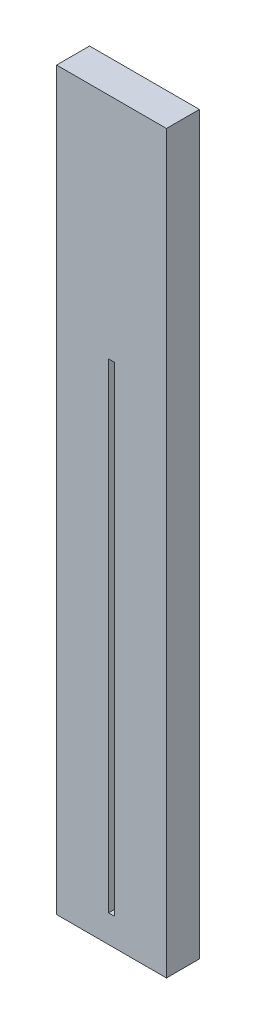
ISO-10303-21;
HEADER;
FILE_DESCRIPTION(('STEP AP214'),'2;1');
FILE_NAME('part.step','',(''),(''),'','','');
FILE_SCHEMA(('AUTOMOTIVE_DESIGN { 1 0 10303 214 1 1 1 1 }'));
ENDSEC;
DATA;
#1=APPLICATION_CONTEXT('core data for automotive mechanical design processes');
#2=APPLICATION_PROTOCOL_DEFINITION('international standard','automotive_design',2000,#1);
#3=PRODUCT_CONTEXT('',#1,'mechanical');
#4=PRODUCT('Part','Part','',(#3));
#5=PRODUCT_RELATED_PRODUCT_CATEGORY('part','',(#4));
#6=PRODUCT_DEFINITION_FORMATION('','',#4);
#7=PRODUCT_DEFINITION_CONTEXT('part definition',#1,'design');
#8=PRODUCT_DEFINITION('design','',#6,#7);
#9=PRODUCT_DEFINITION_SHAPE('','',#8);
#10=(LENGTH_UNIT() NAMED_UNIT(*) SI_UNIT(.MILLI.,.METRE.));
#11=(NAMED_UNIT(*) PLANE_ANGLE_UNIT() SI_UNIT($,.RADIAN.));
#12=(NAMED_UNIT(*) SI_UNIT($,.STERADIAN.) SOLID_ANGLE_UNIT());
#13=UNCERTAINTY_MEASURE_WITH_UNIT(LENGTH_MEASURE(1.E-05),#10,'distance_accuracy_value','');
#14=(GEOMETRIC_REPRESENTATION_CONTEXT(3) GLOBAL_UNCERTAINTY_ASSIGNED_CONTEXT((#13)) GLOBAL_UNIT_ASSIGNED_CONTEXT((#10,
#11,#12)) REPRESENTATION_CONTEXT('',''));
#15=CARTESIAN_POINT('',(0.,0.,0.));
#16=DIRECTION('',(0.,0.,1.));
#17=DIRECTION('',(1.,0.,0.));
#18=AXIS2_PLACEMENT_3D('',#15,#16,#17);
#19=CARTESIAN_POINT('',(56.,750.,16.8));
#20=DIRECTION('',(-1.,0.,0.));
#21=DIRECTION('',(0.,0.,1.));
#22=AXIS2_PLACEMENT_3D('',#19,#20,#21);
#23=PLANE('',#22);
#24=DIRECTION('',(0.,0.,-1.));
#25=VECTOR('',#24,1.);
#26=CARTESIAN_POINT('',(56.,0.,16.8));
#27=LINE('',#26,#25);
#28=CARTESIAN_POINT('',(56.,0.,16.8));
#29=VERTEX_POINT('',#28);
#30=CARTESIAN_POINT('',(56.,0.,-16.8));
#31=VERTEX_POINT('',#30);
#32=EDGE_CURVE('E143',#29,#31,#27,.T.);
#33=ORIENTED_EDGE('',*,*,#32,.T.);
#34=DIRECTION('',(0.,-1.,0.));
#35=VECTOR('',#34,1.);
#36=CARTESIAN_POINT('',(56.,750.,-16.8));
#37=LINE('',#36,#35);
#38=CARTESIAN_POINT('',(56.,750.,-16.8));
#39=VERTEX_POINT('',#38);
#40=EDGE_CURVE('E11',#39,#31,#37,.T.);
#41=ORIENTED_EDGE('',*,*,#40,.F.);
#42=DIRECTION('',(0.,0.,-1.));
#43=VECTOR('',#42,1.);
#44=CARTESIAN_POINT('',(56.,750.,16.8));
#45=LINE('',#44,#43);
#46=CARTESIAN_POINT('',(56.,750.,16.8));
#47=VERTEX_POINT('',#46);
#48=EDGE_CURVE('E147',#47,#39,#45,.T.);
#49=ORIENTED_EDGE('',*,*,#48,.F.);
#50=DIRECTION('',(0.,-1.,0.));
#51=VECTOR('',#50,1.);
#52=CARTESIAN_POINT('',(56.,750.,16.8));
#53=LINE('',#52,#51);
#54=EDGE_CURVE('E153',#47,#29,#53,.T.);
#55=ORIENTED_EDGE('',*,*,#54,.T.);
#56=EDGE_LOOP('',(#33,#41,#49,#55));
#57=FACE_BOUND('',#56,.T.);
#58=ADVANCED_FACE('F35',(#57),#23,.F.);
#59=CARTESIAN_POINT('',(-56.,750.,-16.8));
#60=DIRECTION('',(0.,0.,1.));
#61=DIRECTION('',(1.,0.,0.));
#62=AXIS2_PLACEMENT_3D('',#59,#60,#61);
#63=PLANE('',#62);
#64=DIRECTION('',(-1.,0.,0.));
#65=VECTOR('',#64,1.);
#66=CARTESIAN_POINT('',(-56.,0.,-16.8));
#67=LINE('',#66,#65);
#68=CARTESIAN_POINT('',(-56.,0.,-16.8));
#69=VERTEX_POINT('',#68);
#70=EDGE_CURVE('E156',#31,#69,#67,.T.);
#71=ORIENTED_EDGE('',*,*,#70,.T.);
#72=DIRECTION('',(0.,-1.,0.));
#73=VECTOR('',#72,1.);
#74=CARTESIAN_POINT('',(-56.,750.,-16.8));
#75=LINE('',#74,#73);
#76=CARTESIAN_POINT('',(-56.,750.,-16.8));
#77=VERTEX_POINT('',#76);
#78=EDGE_CURVE('E42',#77,#69,#75,.T.);
#79=ORIENTED_EDGE('',*,*,#78,.F.);
#80=DIRECTION('',(-1.,0.,0.));
#81=VECTOR('',#80,1.);
#82=CARTESIAN_POINT('',(-56.,750.,-16.8));
#83=LINE('',#82,#81);
#84=EDGE_CURVE('E86',#39,#77,#83,.T.);
#85=ORIENTED_EDGE('',*,*,#84,.F.);
#86=ORIENTED_EDGE('',*,*,#40,.T.);
#87=EDGE_LOOP('',(#71,#79,#85,#86));
#88=FACE_BOUND('',#87,.T.);
#89=ADVANCED_FACE('F185',(#88),#63,.F.);
#90=CARTESIAN_POINT('',(-56.,750.,16.8));
#91=DIRECTION('',(1.,0.,0.));
#92=DIRECTION('',(0.,0.,-1.));
#93=AXIS2_PLACEMENT_3D('',#90,#91,#92);
#94=PLANE('',#93);
#95=DIRECTION('',(0.,0.,1.));
#96=VECTOR('',#95,1.);
#97=CARTESIAN_POINT('',(-56.,0.,16.8));
#98=LINE('',#97,#96);
#99=CARTESIAN_POINT('',(-56.,0.,16.8));
#100=VERTEX_POINT('',#99);
#101=EDGE_CURVE('E158',#69,#100,#98,.T.);
#102=ORIENTED_EDGE('',*,*,#101,.T.);
#103=DIRECTION('',(0.,-1.,0.));
#104=VECTOR('',#103,1.);
#105=CARTESIAN_POINT('',(-56.,750.,16.8));
#106=LINE('',#105,#104);
#107=CARTESIAN_POINT('',(-56.,750.,16.8));
#108=VERTEX_POINT('',#107);
#109=EDGE_CURVE('E162',#108,#100,#106,.T.);
#110=ORIENTED_EDGE('',*,*,#109,.F.);
#111=DIRECTION('',(0.,0.,1.));
#112=VECTOR('',#111,1.);
#113=CARTESIAN_POINT('',(-56.,750.,16.8));
#114=LINE('',#113,#112);
#115=EDGE_CURVE('E150',#77,#108,#114,.T.);
#116=ORIENTED_EDGE('',*,*,#115,.F.);
#117=ORIENTED_EDGE('',*,*,#78,.T.);
#118=EDGE_LOOP('',(#102,#110,#116,#117));
#119=FACE_BOUND('',#118,.T.);
#120=ADVANCED_FACE('F167',(#119),#94,.F.);
#121=CARTESIAN_POINT('',(-56.,750.,16.8));
#122=DIRECTION('',(0.,0.,-1.));
#123=DIRECTION('',(-1.,0.,0.));
#124=AXIS2_PLACEMENT_3D('',#121,#122,#123);
#125=PLANE('',#124);
#126=DIRECTION('',(-1.,0.,0.));
#127=VECTOR('',#126,1.);
#128=CARTESIAN_POINT('',(3.05,517.1,16.8));
#129=LINE('',#128,#127);
#130=CARTESIAN_POINT('',(3.05,517.1,16.8));
#131=VERTEX_POINT('',#130);
#132=CARTESIAN_POINT('',(-3.05,517.1,16.8));
#133=VERTEX_POINT('',#132);
#134=EDGE_CURVE('E137',#131,#133,#129,.T.);
#135=ORIENTED_EDGE('',*,*,#134,.F.);
#136=DIRECTION('',(0.,1.,0.));
#137=VECTOR('',#136,1.);
#138=CARTESIAN_POINT('',(3.05,28.,16.8));
#139=LINE('',#138,#137);
#140=CARTESIAN_POINT('',(3.05,28.,16.8));
#141=VERTEX_POINT('',#140);
#142=EDGE_CURVE('E49',#141,#131,#139,.T.);
#143=ORIENTED_EDGE('',*,*,#142,.F.);
#144=DIRECTION('',(1.,0.,0.));
#145=VECTOR('',#144,1.);
#146=CARTESIAN_POINT('',(-3.05,28.,16.8));
#147=LINE('',#146,#145);
#148=CARTESIAN_POINT('',(-3.05,28.,16.8));
#149=VERTEX_POINT('',#148);
#150=EDGE_CURVE('E128',#149,#141,#147,.T.);
#151=ORIENTED_EDGE('',*,*,#150,.F.);
#152=DIRECTION('',(0.,-1.,0.));
#153=VECTOR('',#152,1.);
#154=CARTESIAN_POINT('',(-3.05,28.,16.8));
#155=LINE('',#154,#153);
#156=EDGE_CURVE('E131',#133,#149,#155,.T.);
#157=ORIENTED_EDGE('',*,*,#156,.F.);
#158=EDGE_LOOP('',(#135,#143,#151,#157));
#159=FACE_BOUND('',#158,.T.);
#160=DIRECTION('',(1.,0.,0.));
#161=VECTOR('',#160,1.);
#162=CARTESIAN_POINT('',(-56.,0.,16.8));
#163=LINE('',#162,#161);
#164=EDGE_CURVE('E79',#100,#29,#163,.T.);
#165=ORIENTED_EDGE('',*,*,#164,.T.);
#166=ORIENTED_EDGE('',*,*,#54,.F.);
#167=DIRECTION('',(1.,0.,0.));
#168=VECTOR('',#167,1.);
#169=CARTESIAN_POINT('',(-56.,750.,16.8));
#170=LINE('',#169,#168);
#171=EDGE_CURVE('E58',#108,#47,#170,.T.);
#172=ORIENTED_EDGE('',*,*,#171,.F.);
#173=ORIENTED_EDGE('',*,*,#109,.T.);
#174=EDGE_LOOP('',(#165,#166,#172,#173));
#175=FACE_BOUND('',#174,.T.);
#176=ADVANCED_FACE('F175',(#159,#175),#125,.F.);
#177=CARTESIAN_POINT('',(0.,750.,0.));
#178=DIRECTION('',(0.,-1.,0.));
#179=DIRECTION('',(0.,0.,-1.));
#180=AXIS2_PLACEMENT_3D('',#177,#178,#179);
#181=PLANE('',#180);
#182=ORIENTED_EDGE('',*,*,#48,.T.);
#183=ORIENTED_EDGE('',*,*,#84,.T.);
#184=ORIENTED_EDGE('',*,*,#115,.T.);
#185=ORIENTED_EDGE('',*,*,#171,.T.);
#186=EDGE_LOOP('',(#182,#183,#184,#185));
#187=FACE_BOUND('',#186,.T.);
#188=ADVANCED_FACE('F177',(#187),#181,.F.);
#189=CARTESIAN_POINT('',(0.,0.,0.));
#190=DIRECTION('',(0.,-1.,0.));
#191=DIRECTION('',(0.,0.,-1.));
#192=AXIS2_PLACEMENT_3D('',#189,#190,#191);
#193=PLANE('',#192);
#194=ORIENTED_EDGE('',*,*,#32,.F.);
#195=ORIENTED_EDGE('',*,*,#164,.F.);
#196=ORIENTED_EDGE('',*,*,#101,.F.);
#197=ORIENTED_EDGE('',*,*,#70,.F.);
#198=EDGE_LOOP('',(#194,#195,#196,#197));
#199=FACE_BOUND('',#198,.T.);
#200=ADVANCED_FACE('F171',(#199),#193,.T.);
#201=CARTESIAN_POINT('',(3.05,28.,6.7));
#202=DIRECTION('',(1.,0.,0.));
#203=DIRECTION('',(0.,1.,0.));
#204=AXIS2_PLACEMENT_3D('',#201,#202,#203);
#205=PLANE('',#204);
#206=ORIENTED_EDGE('',*,*,#142,.T.);
#207=DIRECTION('',(0.,0.,1.));
#208=VECTOR('',#207,1.);
#209=CARTESIAN_POINT('',(3.05,517.1,6.7));
#210=LINE('',#209,#208);
#211=CARTESIAN_POINT('',(3.05,517.1,6.7));
#212=VERTEX_POINT('',#211);
#213=EDGE_CURVE('E106',#212,#131,#210,.T.);
#214=ORIENTED_EDGE('',*,*,#213,.F.);
#215=DIRECTION('',(0.,1.,0.));
#216=VECTOR('',#215,1.);
#217=CARTESIAN_POINT('',(3.05,28.,6.7));
#218=LINE('',#217,#216);
#219=CARTESIAN_POINT('',(3.05,28.,6.7));
#220=VERTEX_POINT('',#219);
#221=EDGE_CURVE('E110',#220,#212,#218,.T.);
#222=ORIENTED_EDGE('',*,*,#221,.F.);
#223=DIRECTION('',(0.,0.,1.));
#224=VECTOR('',#223,1.);
#225=CARTESIAN_POINT('',(3.05,28.,6.7));
#226=LINE('',#225,#224);
#227=EDGE_CURVE('E141',#220,#141,#226,.T.);
#228=ORIENTED_EDGE('',*,*,#227,.T.);
#229=EDGE_LOOP('',(#206,#214,#222,#228));
#230=FACE_BOUND('',#229,.T.);
#231=ADVANCED_FACE('F108',(#230),#205,.F.);
#232=CARTESIAN_POINT('',(-3.05,28.,6.7));
#233=DIRECTION('',(0.,-1.,0.));
#234=DIRECTION('',(0.,0.,-1.));
#235=AXIS2_PLACEMENT_3D('',#232,#233,#234);
#236=PLANE('',#235);
#237=ORIENTED_EDGE('',*,*,#150,.T.);
#238=ORIENTED_EDGE('',*,*,#227,.F.);
#239=DIRECTION('',(1.,0.,0.));
#240=VECTOR('',#239,1.);
#241=CARTESIAN_POINT('',(-3.05,28.,6.7));
#242=LINE('',#241,#240);
#243=CARTESIAN_POINT('',(-3.05,28.,6.7));
#244=VERTEX_POINT('',#243);
#245=EDGE_CURVE('E116',#244,#220,#242,.T.);
#246=ORIENTED_EDGE('',*,*,#245,.F.);
#247=DIRECTION('',(0.,0.,1.));
#248=VECTOR('',#247,1.);
#249=CARTESIAN_POINT('',(-3.05,28.,6.7));
#250=LINE('',#249,#248);
#251=EDGE_CURVE('E144',#244,#149,#250,.T.);
#252=ORIENTED_EDGE('',*,*,#251,.T.);
#253=EDGE_LOOP('',(#237,#238,#246,#252));
#254=FACE_BOUND('',#253,.T.);
#255=ADVANCED_FACE('F224',(#254),#236,.F.);
#256=CARTESIAN_POINT('',(-3.05,28.,6.7));
#257=DIRECTION('',(-1.,0.,0.));
#258=DIRECTION('',(0.,-1.,0.));
#259=AXIS2_PLACEMENT_3D('',#256,#257,#258);
#260=PLANE('',#259);
#261=ORIENTED_EDGE('',*,*,#156,.T.);
#262=ORIENTED_EDGE('',*,*,#251,.F.);
#263=DIRECTION('',(0.,-1.,0.));
#264=VECTOR('',#263,1.);
#265=CARTESIAN_POINT('',(-3.05,28.,6.7));
#266=LINE('',#265,#264);
#267=CARTESIAN_POINT('',(-3.05,517.1,6.7));
#268=VERTEX_POINT('',#267);
#269=EDGE_CURVE('E124',#268,#244,#266,.T.);
#270=ORIENTED_EDGE('',*,*,#269,.F.);
#271=DIRECTION('',(0.,0.,1.));
#272=VECTOR('',#271,1.);
#273=CARTESIAN_POINT('',(-3.05,517.1,6.7));
#274=LINE('',#273,#272);
#275=EDGE_CURVE('E115',#268,#133,#274,.T.);
#276=ORIENTED_EDGE('',*,*,#275,.T.);
#277=EDGE_LOOP('',(#261,#262,#270,#276));
#278=FACE_BOUND('',#277,.T.);
#279=ADVANCED_FACE('F233',(#278),#260,.F.);
#280=CARTESIAN_POINT('',(3.05,517.1,6.7));
#281=DIRECTION('',(0.,1.,0.));
#282=DIRECTION('',(0.,0.,1.));
#283=AXIS2_PLACEMENT_3D('',#280,#281,#282);
#284=PLANE('',#283);
#285=ORIENTED_EDGE('',*,*,#134,.T.);
#286=ORIENTED_EDGE('',*,*,#275,.F.);
#287=DIRECTION('',(-1.,0.,0.));
#288=VECTOR('',#287,1.);
#289=CARTESIAN_POINT('',(3.05,517.1,6.7));
#290=LINE('',#289,#288);
#291=EDGE_CURVE('E119',#212,#268,#290,.T.);
#292=ORIENTED_EDGE('',*,*,#291,.F.);
#293=ORIENTED_EDGE('',*,*,#213,.T.);
#294=EDGE_LOOP('',(#285,#286,#292,#293));
#295=FACE_BOUND('',#294,.T.);
#296=ADVANCED_FACE('F120',(#295),#284,.F.);
#297=CARTESIAN_POINT('',(0.,0.,6.7));
#298=DIRECTION('',(0.,0.,1.));
#299=DIRECTION('',(1.,0.,0.));
#300=AXIS2_PLACEMENT_3D('',#297,#298,#299);
#301=PLANE('',#300);
#302=ORIENTED_EDGE('',*,*,#221,.T.);
#303=ORIENTED_EDGE('',*,*,#291,.T.);
#304=ORIENTED_EDGE('',*,*,#269,.T.);
#305=ORIENTED_EDGE('',*,*,#245,.T.);
#306=EDGE_LOOP('',(#302,#303,#304,#305));
#307=FACE_BOUND('',#306,.T.);
#308=ADVANCED_FACE('F126',(#307),#301,.T.);
#309=CLOSED_SHELL('',(#58,#89,#120,#176,#188,#200,#231,#255,#279,#296,#308));
#310=MANIFOLD_SOLID_BREP('B2',#309);
#311=ADVANCED_BREP_SHAPE_REPRESENTATION('',(#18,#310),#14);
#312=SHAPE_DEFINITION_REPRESENTATION(#9,#311);
ENDSEC;
END-ISO-10303-21;
